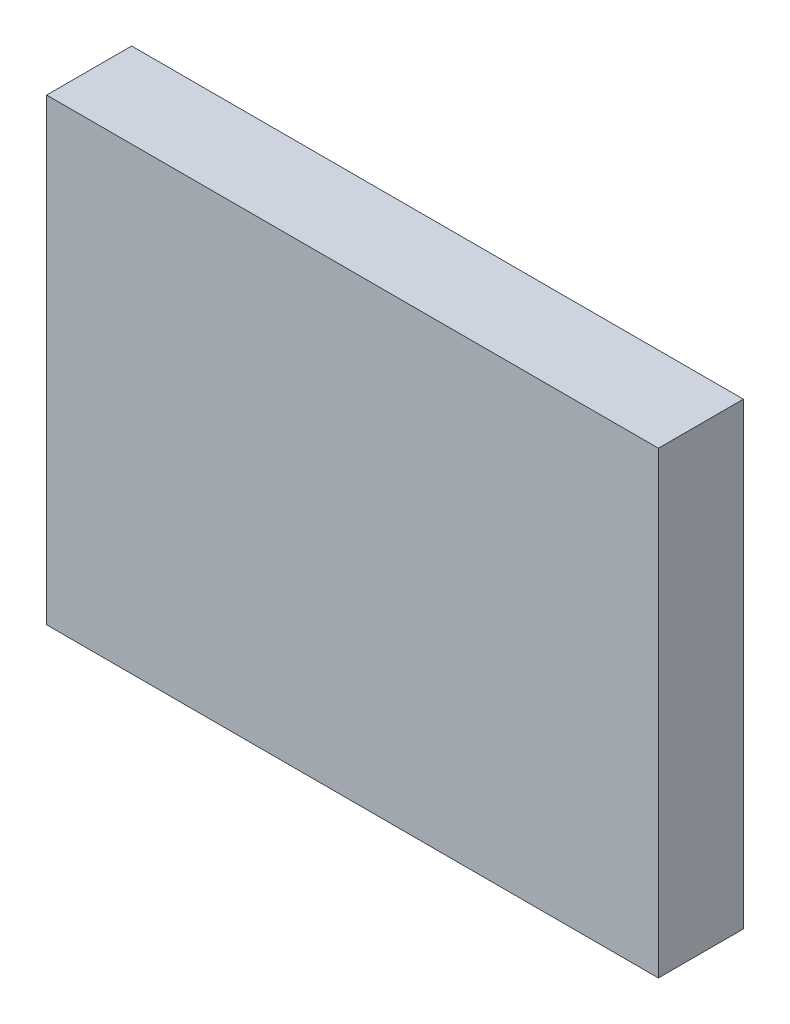
ISO-10303-21;
HEADER;
FILE_DESCRIPTION(('STEP AP214'),'2;1');
FILE_NAME('part.step','',(''),(''),'','','');
FILE_SCHEMA(('AUTOMOTIVE_DESIGN { 1 0 10303 214 1 1 1 1 }'));
ENDSEC;
DATA;
#1=APPLICATION_CONTEXT('core data for automotive mechanical design processes');
#2=APPLICATION_PROTOCOL_DEFINITION('international standard','automotive_design',2000,#1);
#3=PRODUCT_CONTEXT('',#1,'mechanical');
#4=PRODUCT('Part','Part','',(#3));
#5=PRODUCT_RELATED_PRODUCT_CATEGORY('part','',(#4));
#6=PRODUCT_DEFINITION_FORMATION('','',#4);
#7=PRODUCT_DEFINITION_CONTEXT('part definition',#1,'design');
#8=PRODUCT_DEFINITION('design','',#6,#7);
#9=PRODUCT_DEFINITION_SHAPE('','',#8);
#10=(LENGTH_UNIT() NAMED_UNIT(*) SI_UNIT(.MILLI.,.METRE.));
#11=(NAMED_UNIT(*) PLANE_ANGLE_UNIT() SI_UNIT($,.RADIAN.));
#12=(NAMED_UNIT(*) SI_UNIT($,.STERADIAN.) SOLID_ANGLE_UNIT());
#13=UNCERTAINTY_MEASURE_WITH_UNIT(LENGTH_MEASURE(1.E-05),#10,'distance_accuracy_value','');
#14=(GEOMETRIC_REPRESENTATION_CONTEXT(3) GLOBAL_UNCERTAINTY_ASSIGNED_CONTEXT((#13)) GLOBAL_UNIT_ASSIGNED_CONTEXT((#10,
#11,#12)) REPRESENTATION_CONTEXT('',''));
#15=CARTESIAN_POINT('',(0.,0.,0.));
#16=DIRECTION('',(0.,0.,1.));
#17=DIRECTION('',(1.,0.,0.));
#18=AXIS2_PLACEMENT_3D('',#15,#16,#17);
#19=CARTESIAN_POINT('',(180.,135.,50.));
#20=DIRECTION('',(-1.,0.,0.));
#21=DIRECTION('',(0.,0.,1.));
#22=AXIS2_PLACEMENT_3D('',#19,#20,#21);
#23=PLANE('',#22);
#24=DIRECTION('',(0.,1.,0.));
#25=VECTOR('',#24,1.);
#26=CARTESIAN_POINT('',(180.,135.,0.));
#27=LINE('',#26,#25);
#28=CARTESIAN_POINT('',(180.,-135.,0.));
#29=VERTEX_POINT('',#28);
#30=CARTESIAN_POINT('',(180.,135.,0.));
#31=VERTEX_POINT('',#30);
#32=EDGE_CURVE('E109',#29,#31,#27,.T.);
#33=ORIENTED_EDGE('',*,*,#32,.T.);
#34=DIRECTION('',(0.,0.,-1.));
#35=VECTOR('',#34,1.);
#36=CARTESIAN_POINT('',(180.,135.,50.));
#37=LINE('',#36,#35);
#38=CARTESIAN_POINT('',(180.,135.,50.));
#39=VERTEX_POINT('',#38);
#40=EDGE_CURVE('E11',#39,#31,#37,.T.);
#41=ORIENTED_EDGE('',*,*,#40,.F.);
#42=DIRECTION('',(0.,1.,0.));
#43=VECTOR('',#42,1.);
#44=CARTESIAN_POINT('',(180.,135.,50.));
#45=LINE('',#44,#43);
#46=CARTESIAN_POINT('',(180.,-135.,50.));
#47=VERTEX_POINT('',#46);
#48=EDGE_CURVE('E92',#47,#39,#45,.T.);
#49=ORIENTED_EDGE('',*,*,#48,.F.);
#50=DIRECTION('',(0.,0.,-1.));
#51=VECTOR('',#50,1.);
#52=CARTESIAN_POINT('',(180.,-135.,50.));
#53=LINE('',#52,#51);
#54=EDGE_CURVE('E105',#47,#29,#53,.T.);
#55=ORIENTED_EDGE('',*,*,#54,.T.);
#56=EDGE_LOOP('',(#33,#41,#49,#55));
#57=FACE_BOUND('',#56,.T.);
#58=ADVANCED_FACE('F41',(#57),#23,.F.);
#59=CARTESIAN_POINT('',(-180.,135.,50.));
#60=DIRECTION('',(0.,-1.,0.));
#61=DIRECTION('',(0.,0.,-1.));
#62=AXIS2_PLACEMENT_3D('',#59,#60,#61);
#63=PLANE('',#62);
#64=DIRECTION('',(-1.,0.,0.));
#65=VECTOR('',#64,1.);
#66=CARTESIAN_POINT('',(-180.,135.,0.));
#67=LINE('',#66,#65);
#68=CARTESIAN_POINT('',(-180.,135.,0.));
#69=VERTEX_POINT('',#68);
#70=EDGE_CURVE('E97',#31,#69,#67,.T.);
#71=ORIENTED_EDGE('',*,*,#70,.T.);
#72=DIRECTION('',(0.,0.,-1.));
#73=VECTOR('',#72,1.);
#74=CARTESIAN_POINT('',(-180.,135.,50.));
#75=LINE('',#74,#73);
#76=CARTESIAN_POINT('',(-180.,135.,50.));
#77=VERTEX_POINT('',#76);
#78=EDGE_CURVE('E49',#77,#69,#75,.T.);
#79=ORIENTED_EDGE('',*,*,#78,.F.);
#80=DIRECTION('',(-1.,0.,0.));
#81=VECTOR('',#80,1.);
#82=CARTESIAN_POINT('',(-180.,135.,50.));
#83=LINE('',#82,#81);
#84=EDGE_CURVE('E87',#39,#77,#83,.T.);
#85=ORIENTED_EDGE('',*,*,#84,.F.);
#86=ORIENTED_EDGE('',*,*,#40,.T.);
#87=EDGE_LOOP('',(#71,#79,#85,#86));
#88=FACE_BOUND('',#87,.T.);
#89=ADVANCED_FACE('F96',(#88),#63,.F.);
#90=CARTESIAN_POINT('',(-180.,135.,50.));
#91=DIRECTION('',(1.,0.,0.));
#92=DIRECTION('',(0.,0.,-1.));
#93=AXIS2_PLACEMENT_3D('',#90,#91,#92);
#94=PLANE('',#93);
#95=DIRECTION('',(0.,-1.,0.));
#96=VECTOR('',#95,1.);
#97=CARTESIAN_POINT('',(-180.,135.,0.));
#98=LINE('',#97,#96);
#99=CARTESIAN_POINT('',(-180.,-135.,0.));
#100=VERTEX_POINT('',#99);
#101=EDGE_CURVE('E74',#69,#100,#98,.T.);
#102=ORIENTED_EDGE('',*,*,#101,.T.);
#103=DIRECTION('',(0.,0.,-1.));
#104=VECTOR('',#103,1.);
#105=CARTESIAN_POINT('',(-180.,-135.,50.));
#106=LINE('',#105,#104);
#107=CARTESIAN_POINT('',(-180.,-135.,50.));
#108=VERTEX_POINT('',#107);
#109=EDGE_CURVE('E98',#108,#100,#106,.T.);
#110=ORIENTED_EDGE('',*,*,#109,.F.);
#111=DIRECTION('',(0.,-1.,0.));
#112=VECTOR('',#111,1.);
#113=CARTESIAN_POINT('',(-180.,135.,50.));
#114=LINE('',#113,#112);
#115=EDGE_CURVE('E90',#77,#108,#114,.T.);
#116=ORIENTED_EDGE('',*,*,#115,.F.);
#117=ORIENTED_EDGE('',*,*,#78,.T.);
#118=EDGE_LOOP('',(#102,#110,#116,#117));
#119=FACE_BOUND('',#118,.T.);
#120=ADVANCED_FACE('F99',(#119),#94,.F.);
#121=CARTESIAN_POINT('',(-180.,-135.,50.));
#122=DIRECTION('',(0.,1.,0.));
#123=DIRECTION('',(0.,0.,1.));
#124=AXIS2_PLACEMENT_3D('',#121,#122,#123);
#125=PLANE('',#124);
#126=DIRECTION('',(1.,0.,0.));
#127=VECTOR('',#126,1.);
#128=CARTESIAN_POINT('',(-180.,-135.,0.));
#129=LINE('',#128,#127);
#130=EDGE_CURVE('E80',#100,#29,#129,.T.);
#131=ORIENTED_EDGE('',*,*,#130,.T.);
#132=ORIENTED_EDGE('',*,*,#54,.F.);
#133=DIRECTION('',(1.,0.,0.));
#134=VECTOR('',#133,1.);
#135=CARTESIAN_POINT('',(-180.,-135.,50.));
#136=LINE('',#135,#134);
#137=EDGE_CURVE('E57',#108,#47,#136,.T.);
#138=ORIENTED_EDGE('',*,*,#137,.F.);
#139=ORIENTED_EDGE('',*,*,#109,.T.);
#140=EDGE_LOOP('',(#131,#132,#138,#139));
#141=FACE_BOUND('',#140,.T.);
#142=ADVANCED_FACE('F117',(#141),#125,.F.);
#143=CARTESIAN_POINT('',(0.,0.,50.));
#144=DIRECTION('',(0.,0.,1.));
#145=DIRECTION('',(1.,0.,0.));
#146=AXIS2_PLACEMENT_3D('',#143,#144,#145);
#147=PLANE('',#146);
#148=ORIENTED_EDGE('',*,*,#48,.T.);
#149=ORIENTED_EDGE('',*,*,#84,.T.);
#150=ORIENTED_EDGE('',*,*,#115,.T.);
#151=ORIENTED_EDGE('',*,*,#137,.T.);
#152=EDGE_LOOP('',(#148,#149,#150,#151));
#153=FACE_BOUND('',#152,.T.);
#154=ADVANCED_FACE('F88',(#153),#147,.T.);
#155=CARTESIAN_POINT('',(0.,0.,0.));
#156=DIRECTION('',(0.,0.,1.));
#157=DIRECTION('',(1.,0.,0.));
#158=AXIS2_PLACEMENT_3D('',#155,#156,#157);
#159=PLANE('',#158);
#160=ORIENTED_EDGE('',*,*,#32,.F.);
#161=ORIENTED_EDGE('',*,*,#130,.F.);
#162=ORIENTED_EDGE('',*,*,#101,.F.);
#163=ORIENTED_EDGE('',*,*,#70,.F.);
#164=EDGE_LOOP('',(#160,#161,#162,#163));
#165=FACE_BOUND('',#164,.T.);
#166=ADVANCED_FACE('F120',(#165),#159,.F.);
#167=CLOSED_SHELL('',(#58,#89,#120,#142,#154,#166));
#168=MANIFOLD_SOLID_BREP('B2',#167);
#169=ADVANCED_BREP_SHAPE_REPRESENTATION('',(#18,#168),#14);
#170=SHAPE_DEFINITION_REPRESENTATION(#9,#169);
ENDSEC;
END-ISO-10303-21;
